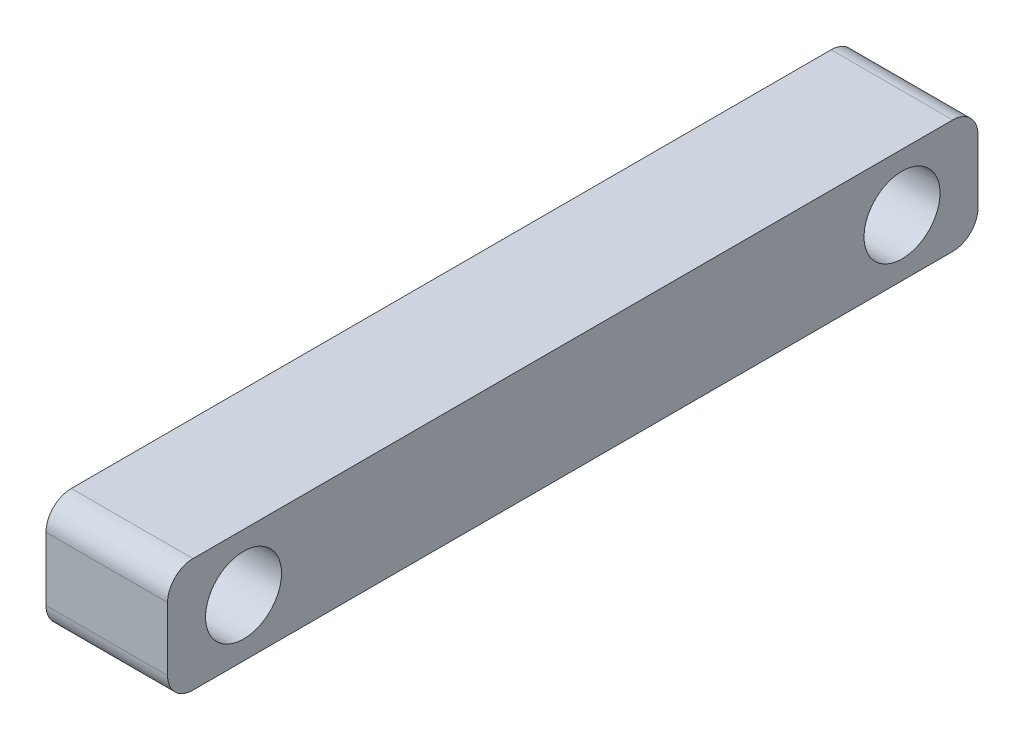
ISO-10303-21;
HEADER;
FILE_DESCRIPTION(('STEP AP214'),'2;1');
FILE_NAME('part.step','',(''),(''),'','','');
FILE_SCHEMA(('AUTOMOTIVE_DESIGN { 1 0 10303 214 1 1 1 1 }'));
ENDSEC;
DATA;
#1=APPLICATION_CONTEXT('core data for automotive mechanical design processes');
#2=APPLICATION_PROTOCOL_DEFINITION('international standard','automotive_design',2000,#1);
#3=PRODUCT_CONTEXT('',#1,'mechanical');
#4=PRODUCT('Part','Part','',(#3));
#5=PRODUCT_RELATED_PRODUCT_CATEGORY('part','',(#4));
#6=PRODUCT_DEFINITION_FORMATION('','',#4);
#7=PRODUCT_DEFINITION_CONTEXT('part definition',#1,'design');
#8=PRODUCT_DEFINITION('design','',#6,#7);
#9=PRODUCT_DEFINITION_SHAPE('','',#8);
#10=(LENGTH_UNIT() NAMED_UNIT(*) SI_UNIT(.MILLI.,.METRE.));
#11=(NAMED_UNIT(*) PLANE_ANGLE_UNIT() SI_UNIT($,.RADIAN.));
#12=(NAMED_UNIT(*) SI_UNIT($,.STERADIAN.) SOLID_ANGLE_UNIT());
#13=UNCERTAINTY_MEASURE_WITH_UNIT(LENGTH_MEASURE(1.E-05),#10,'distance_accuracy_value','');
#14=(GEOMETRIC_REPRESENTATION_CONTEXT(3) GLOBAL_UNCERTAINTY_ASSIGNED_CONTEXT((#13)) GLOBAL_UNIT_ASSIGNED_CONTEXT((#10,
#11,#12)) REPRESENTATION_CONTEXT('',''));
#15=CARTESIAN_POINT('',(0.,0.,0.));
#16=DIRECTION('',(0.,0.,1.));
#17=DIRECTION('',(1.,0.,0.));
#18=AXIS2_PLACEMENT_3D('',#15,#16,#17);
#19=CARTESIAN_POINT('',(2.4,-1.25,15.));
#20=DIRECTION('',(-1.,0.,0.));
#21=DIRECTION('',(0.,0.,1.));
#22=AXIS2_PLACEMENT_3D('',#19,#20,#21);
#23=CYLINDRICAL_SURFACE('',#22,1.);
#24=CARTESIAN_POINT('',(-2.4,-1.25,15.));
#25=DIRECTION('',(1.,0.,0.));
#26=DIRECTION('',(0.,0.,-1.));
#27=AXIS2_PLACEMENT_3D('',#24,#25,#26);
#28=CIRCLE('',#27,1.);
#29=CARTESIAN_POINT('',(-2.4,-1.25,16.));
#30=VERTEX_POINT('',#29);
#31=CARTESIAN_POINT('',(-2.4,-2.25,15.));
#32=VERTEX_POINT('',#31);
#33=EDGE_CURVE('E129',#30,#32,#28,.T.);
#34=ORIENTED_EDGE('',*,*,#33,.T.);
#35=DIRECTION('',(-1.,0.,0.));
#36=VECTOR('',#35,1.);
#37=CARTESIAN_POINT('',(2.4,-2.25,15.));
#38=LINE('',#37,#36);
#39=CARTESIAN_POINT('',(2.4,-2.25,15.));
#40=VERTEX_POINT('',#39);
#41=EDGE_CURVE('E11',#40,#32,#38,.T.);
#42=ORIENTED_EDGE('',*,*,#41,.F.);
#43=CARTESIAN_POINT('',(2.4,-1.25,15.));
#44=DIRECTION('',(1.,0.,0.));
#45=DIRECTION('',(0.,0.,-1.));
#46=AXIS2_PLACEMENT_3D('',#43,#44,#45);
#47=CIRCLE('',#46,1.);
#48=CARTESIAN_POINT('',(2.4,-1.25,16.));
#49=VERTEX_POINT('',#48);
#50=EDGE_CURVE('E144',#49,#40,#47,.T.);
#51=ORIENTED_EDGE('',*,*,#50,.F.);
#52=DIRECTION('',(-1.,0.,0.));
#53=VECTOR('',#52,1.);
#54=CARTESIAN_POINT('',(2.4,-1.25,16.));
#55=LINE('',#54,#53);
#56=EDGE_CURVE('E125',#49,#30,#55,.T.);
#57=ORIENTED_EDGE('',*,*,#56,.T.);
#58=EDGE_LOOP('',(#34,#42,#51,#57));
#59=FACE_BOUND('',#58,.T.);
#60=ADVANCED_FACE('F33',(#59),#23,.T.);
#61=CARTESIAN_POINT('',(2.4,-2.25,15.));
#62=DIRECTION('',(0.,1.,0.));
#63=DIRECTION('',(0.,0.,1.));
#64=AXIS2_PLACEMENT_3D('',#61,#62,#63);
#65=PLANE('',#64);
#66=DIRECTION('',(0.,0.,-1.));
#67=VECTOR('',#66,1.);
#68=CARTESIAN_POINT('',(-2.4,-2.25,15.));
#69=LINE('',#68,#67);
#70=CARTESIAN_POINT('',(-2.4,-2.25,-15.));
#71=VERTEX_POINT('',#70);
#72=EDGE_CURVE('E132',#32,#71,#69,.T.);
#73=ORIENTED_EDGE('',*,*,#72,.T.);
#74=DIRECTION('',(-1.,0.,0.));
#75=VECTOR('',#74,1.);
#76=CARTESIAN_POINT('',(2.4,-2.25,-15.));
#77=LINE('',#76,#75);
#78=CARTESIAN_POINT('',(2.4,-2.25,-15.));
#79=VERTEX_POINT('',#78);
#80=EDGE_CURVE('E41',#79,#71,#77,.T.);
#81=ORIENTED_EDGE('',*,*,#80,.F.);
#82=DIRECTION('',(0.,0.,-1.));
#83=VECTOR('',#82,1.);
#84=CARTESIAN_POINT('',(2.4,-2.25,15.));
#85=LINE('',#84,#83);
#86=EDGE_CURVE('E92',#40,#79,#85,.T.);
#87=ORIENTED_EDGE('',*,*,#86,.F.);
#88=ORIENTED_EDGE('',*,*,#41,.T.);
#89=EDGE_LOOP('',(#73,#81,#87,#88));
#90=FACE_BOUND('',#89,.T.);
#91=ADVANCED_FACE('F211',(#90),#65,.F.);
#92=CARTESIAN_POINT('',(2.4,-1.25,-15.));
#93=DIRECTION('',(-1.,0.,0.));
#94=DIRECTION('',(0.,0.,1.));
#95=AXIS2_PLACEMENT_3D('',#92,#93,#94);
#96=CYLINDRICAL_SURFACE('',#95,0.999999999999999);
#97=CARTESIAN_POINT('',(-2.4,-1.25,-15.));
#98=DIRECTION('',(1.,0.,0.));
#99=DIRECTION('',(0.,0.,-1.));
#100=AXIS2_PLACEMENT_3D('',#97,#98,#99);
#101=CIRCLE('',#100,0.999999999999999);
#102=CARTESIAN_POINT('',(-2.4,-1.25,-16.));
#103=VERTEX_POINT('',#102);
#104=EDGE_CURVE('E135',#71,#103,#101,.T.);
#105=ORIENTED_EDGE('',*,*,#104,.T.);
#106=DIRECTION('',(-1.,0.,0.));
#107=VECTOR('',#106,1.);
#108=CARTESIAN_POINT('',(2.4,-1.25,-16.));
#109=LINE('',#108,#107);
#110=CARTESIAN_POINT('',(2.4,-1.25,-16.));
#111=VERTEX_POINT('',#110);
#112=EDGE_CURVE('E151',#111,#103,#109,.T.);
#113=ORIENTED_EDGE('',*,*,#112,.F.);
#114=CARTESIAN_POINT('',(2.4,-1.25,-15.));
#115=DIRECTION('',(1.,0.,0.));
#116=DIRECTION('',(0.,0.,-1.));
#117=AXIS2_PLACEMENT_3D('',#114,#115,#116);
#118=CIRCLE('',#117,0.999999999999999);
#119=EDGE_CURVE('E159',#79,#111,#118,.T.);
#120=ORIENTED_EDGE('',*,*,#119,.F.);
#121=ORIENTED_EDGE('',*,*,#80,.T.);
#122=EDGE_LOOP('',(#105,#113,#120,#121));
#123=FACE_BOUND('',#122,.T.);
#124=ADVANCED_FACE('F157',(#123),#96,.T.);
#125=CARTESIAN_POINT('',(2.4,1.25,-16.));
#126=DIRECTION('',(0.,0.,1.));
#127=DIRECTION('',(1.,0.,0.));
#128=AXIS2_PLACEMENT_3D('',#125,#126,#127);
#129=PLANE('',#128);
#130=DIRECTION('',(0.,1.,0.));
#131=VECTOR('',#130,1.);
#132=CARTESIAN_POINT('',(-2.4,1.25,-16.));
#133=LINE('',#132,#131);
#134=CARTESIAN_POINT('',(-2.4,1.25,-16.));
#135=VERTEX_POINT('',#134);
#136=EDGE_CURVE('E137',#103,#135,#133,.T.);
#137=ORIENTED_EDGE('',*,*,#136,.T.);
#138=DIRECTION('',(-1.,0.,0.));
#139=VECTOR('',#138,1.);
#140=CARTESIAN_POINT('',(2.4,1.25,-16.));
#141=LINE('',#140,#139);
#142=CARTESIAN_POINT('',(2.4,1.25,-16.));
#143=VERTEX_POINT('',#142);
#144=EDGE_CURVE('E148',#143,#135,#141,.T.);
#145=ORIENTED_EDGE('',*,*,#144,.F.);
#146=DIRECTION('',(0.,1.,0.));
#147=VECTOR('',#146,1.);
#148=CARTESIAN_POINT('',(2.4,1.25,-16.));
#149=LINE('',#148,#147);
#150=EDGE_CURVE('E171',#111,#143,#149,.T.);
#151=ORIENTED_EDGE('',*,*,#150,.F.);
#152=ORIENTED_EDGE('',*,*,#112,.T.);
#153=EDGE_LOOP('',(#137,#145,#151,#152));
#154=FACE_BOUND('',#153,.T.);
#155=ADVANCED_FACE('F167',(#154),#129,.F.);
#156=CARTESIAN_POINT('',(2.4,1.25,-15.));
#157=DIRECTION('',(-1.,0.,0.));
#158=DIRECTION('',(0.,0.,1.));
#159=AXIS2_PLACEMENT_3D('',#156,#157,#158);
#160=CYLINDRICAL_SURFACE('',#159,0.999999999999999);
#161=CARTESIAN_POINT('',(-2.4,1.25,-15.));
#162=DIRECTION('',(1.,0.,0.));
#163=DIRECTION('',(0.,0.,1.));
#164=AXIS2_PLACEMENT_3D('',#161,#162,#163);
#165=CIRCLE('',#164,0.999999999999999);
#166=CARTESIAN_POINT('',(-2.4,2.25,-15.));
#167=VERTEX_POINT('',#166);
#168=EDGE_CURVE('E139',#135,#167,#165,.T.);
#169=ORIENTED_EDGE('',*,*,#168,.T.);
#170=DIRECTION('',(-1.,0.,0.));
#171=VECTOR('',#170,1.);
#172=CARTESIAN_POINT('',(2.4,2.25,-15.));
#173=LINE('',#172,#171);
#174=CARTESIAN_POINT('',(2.4,2.25,-15.));
#175=VERTEX_POINT('',#174);
#176=EDGE_CURVE('E120',#175,#167,#173,.T.);
#177=ORIENTED_EDGE('',*,*,#176,.F.);
#178=CARTESIAN_POINT('',(2.4,1.25,-15.));
#179=DIRECTION('',(1.,0.,0.));
#180=DIRECTION('',(0.,0.,1.));
#181=AXIS2_PLACEMENT_3D('',#178,#179,#180);
#182=CIRCLE('',#181,0.999999999999999);
#183=EDGE_CURVE('E111',#143,#175,#182,.T.);
#184=ORIENTED_EDGE('',*,*,#183,.F.);
#185=ORIENTED_EDGE('',*,*,#144,.T.);
#186=EDGE_LOOP('',(#169,#177,#184,#185));
#187=FACE_BOUND('',#186,.T.);
#188=ADVANCED_FACE('F170',(#187),#160,.T.);
#189=CARTESIAN_POINT('',(2.4,2.25,15.));
#190=DIRECTION('',(0.,-1.,0.));
#191=DIRECTION('',(0.,0.,-1.));
#192=AXIS2_PLACEMENT_3D('',#189,#190,#191);
#193=PLANE('',#192);
#194=DIRECTION('',(0.,0.,1.));
#195=VECTOR('',#194,1.);
#196=CARTESIAN_POINT('',(-2.4,2.25,15.));
#197=LINE('',#196,#195);
#198=CARTESIAN_POINT('',(-2.4,2.25,15.));
#199=VERTEX_POINT('',#198);
#200=EDGE_CURVE('E119',#167,#199,#197,.T.);
#201=ORIENTED_EDGE('',*,*,#200,.T.);
#202=DIRECTION('',(-1.,0.,0.));
#203=VECTOR('',#202,1.);
#204=CARTESIAN_POINT('',(2.4,2.25,15.));
#205=LINE('',#204,#203);
#206=CARTESIAN_POINT('',(2.4,2.25,15.));
#207=VERTEX_POINT('',#206);
#208=EDGE_CURVE('E116',#207,#199,#205,.T.);
#209=ORIENTED_EDGE('',*,*,#208,.F.);
#210=DIRECTION('',(0.,0.,1.));
#211=VECTOR('',#210,1.);
#212=CARTESIAN_POINT('',(2.4,2.25,15.));
#213=LINE('',#212,#211);
#214=EDGE_CURVE('E105',#175,#207,#213,.T.);
#215=ORIENTED_EDGE('',*,*,#214,.F.);
#216=ORIENTED_EDGE('',*,*,#176,.T.);
#217=EDGE_LOOP('',(#201,#209,#215,#216));
#218=FACE_BOUND('',#217,.T.);
#219=ADVANCED_FACE('F117',(#218),#193,.F.);
#220=CARTESIAN_POINT('',(2.4,1.25,15.));
#221=DIRECTION('',(-1.,0.,0.));
#222=DIRECTION('',(0.,0.,1.));
#223=AXIS2_PLACEMENT_3D('',#220,#221,#222);
#224=CYLINDRICAL_SURFACE('',#223,1.);
#225=CARTESIAN_POINT('',(-2.4,1.25,15.));
#226=DIRECTION('',(1.,0.,0.));
#227=DIRECTION('',(0.,0.,1.));
#228=AXIS2_PLACEMENT_3D('',#225,#226,#227);
#229=CIRCLE('',#228,1.);
#230=CARTESIAN_POINT('',(-2.4,1.25,16.));
#231=VERTEX_POINT('',#230);
#232=EDGE_CURVE('E78',#199,#231,#229,.T.);
#233=ORIENTED_EDGE('',*,*,#232,.T.);
#234=DIRECTION('',(-1.,0.,0.));
#235=VECTOR('',#234,1.);
#236=CARTESIAN_POINT('',(2.4,1.25,16.));
#237=LINE('',#236,#235);
#238=CARTESIAN_POINT('',(2.4,1.25,16.));
#239=VERTEX_POINT('',#238);
#240=EDGE_CURVE('E121',#239,#231,#237,.T.);
#241=ORIENTED_EDGE('',*,*,#240,.F.);
#242=CARTESIAN_POINT('',(2.4,1.25,15.));
#243=DIRECTION('',(1.,0.,0.));
#244=DIRECTION('',(0.,0.,1.));
#245=AXIS2_PLACEMENT_3D('',#242,#243,#244);
#246=CIRCLE('',#245,1.);
#247=EDGE_CURVE('E109',#207,#239,#246,.T.);
#248=ORIENTED_EDGE('',*,*,#247,.F.);
#249=ORIENTED_EDGE('',*,*,#208,.T.);
#250=EDGE_LOOP('',(#233,#241,#248,#249));
#251=FACE_BOUND('',#250,.T.);
#252=ADVANCED_FACE('F123',(#251),#224,.T.);
#253=CARTESIAN_POINT('',(2.4,1.25,16.));
#254=DIRECTION('',(0.,0.,-1.));
#255=DIRECTION('',(-1.,0.,0.));
#256=AXIS2_PLACEMENT_3D('',#253,#254,#255);
#257=PLANE('',#256);
#258=DIRECTION('',(0.,-1.,0.));
#259=VECTOR('',#258,1.);
#260=CARTESIAN_POINT('',(-2.4,1.25,16.));
#261=LINE('',#260,#259);
#262=EDGE_CURVE('E84',#231,#30,#261,.T.);
#263=ORIENTED_EDGE('',*,*,#262,.T.);
#264=ORIENTED_EDGE('',*,*,#56,.F.);
#265=DIRECTION('',(0.,-1.,0.));
#266=VECTOR('',#265,1.);
#267=CARTESIAN_POINT('',(2.4,1.25,16.));
#268=LINE('',#267,#266);
#269=EDGE_CURVE('E49',#239,#49,#268,.T.);
#270=ORIENTED_EDGE('',*,*,#269,.F.);
#271=ORIENTED_EDGE('',*,*,#240,.T.);
#272=EDGE_LOOP('',(#263,#264,#270,#271));
#273=FACE_BOUND('',#272,.T.);
#274=ADVANCED_FACE('F193',(#273),#257,.F.);
#275=CARTESIAN_POINT('',(2.4,-1.25,15.));
#276=DIRECTION('',(1.,0.,0.));
#277=DIRECTION('',(0.,0.,-1.));
#278=AXIS2_PLACEMENT_3D('',#275,#276,#277);
#279=PLANE('',#278);
#280=CARTESIAN_POINT('',(2.4,0.,13.));
#281=DIRECTION('',(1.,0.,0.));
#282=DIRECTION('',(0.,0.,-1.));
#283=AXIS2_PLACEMENT_3D('',#280,#281,#282);
#284=CIRCLE('',#283,1.5);
#285=CARTESIAN_POINT('',(2.4,0.,11.5));
#286=VERTEX_POINT('',#285);
#287=EDGE_CURVE('E180',#286,#286,#284,.T.);
#288=ORIENTED_EDGE('',*,*,#287,.F.);
#289=EDGE_LOOP('',(#288));
#290=FACE_BOUND('',#289,.T.);
#291=CARTESIAN_POINT('',(2.4,0.,-13.));
#292=DIRECTION('',(1.,0.,0.));
#293=DIRECTION('',(0.,0.,-1.));
#294=AXIS2_PLACEMENT_3D('',#291,#292,#293);
#295=CIRCLE('',#294,1.5);
#296=CARTESIAN_POINT('',(2.4,0.,-14.5));
#297=VERTEX_POINT('',#296);
#298=EDGE_CURVE('E181',#297,#297,#295,.T.);
#299=ORIENTED_EDGE('',*,*,#298,.F.);
#300=EDGE_LOOP('',(#299));
#301=FACE_BOUND('',#300,.T.);
#302=ORIENTED_EDGE('',*,*,#50,.T.);
#303=ORIENTED_EDGE('',*,*,#86,.T.);
#304=ORIENTED_EDGE('',*,*,#119,.T.);
#305=ORIENTED_EDGE('',*,*,#150,.T.);
#306=ORIENTED_EDGE('',*,*,#183,.T.);
#307=ORIENTED_EDGE('',*,*,#214,.T.);
#308=ORIENTED_EDGE('',*,*,#247,.T.);
#309=ORIENTED_EDGE('',*,*,#269,.T.);
#310=EDGE_LOOP('',(#302,#303,#304,#305,#306,#307,#308,#309));
#311=FACE_BOUND('',#310,.T.);
#312=ADVANCED_FACE('F107',(#290,#301,#311),#279,.T.);
#313=CARTESIAN_POINT('',(-2.4,-1.25,15.));
#314=DIRECTION('',(1.,0.,0.));
#315=DIRECTION('',(0.,0.,-1.));
#316=AXIS2_PLACEMENT_3D('',#313,#314,#315);
#317=PLANE('',#316);
#318=CARTESIAN_POINT('',(-2.4,0.,13.));
#319=DIRECTION('',(1.,0.,0.));
#320=DIRECTION('',(0.,0.,-1.));
#321=AXIS2_PLACEMENT_3D('',#318,#319,#320);
#322=CIRCLE('',#321,1.5);
#323=CARTESIAN_POINT('',(-2.4,0.,11.5));
#324=VERTEX_POINT('',#323);
#325=EDGE_CURVE('E133',#324,#324,#322,.T.);
#326=ORIENTED_EDGE('',*,*,#325,.T.);
#327=EDGE_LOOP('',(#326));
#328=FACE_BOUND('',#327,.T.);
#329=CARTESIAN_POINT('',(-2.4,0.,-13.));
#330=DIRECTION('',(1.,0.,0.));
#331=DIRECTION('',(0.,0.,-1.));
#332=AXIS2_PLACEMENT_3D('',#329,#330,#331);
#333=CIRCLE('',#332,1.5);
#334=CARTESIAN_POINT('',(-2.4,0.,-14.5));
#335=VERTEX_POINT('',#334);
#336=EDGE_CURVE('E177',#335,#335,#333,.T.);
#337=ORIENTED_EDGE('',*,*,#336,.T.);
#338=EDGE_LOOP('',(#337));
#339=FACE_BOUND('',#338,.T.);
#340=ORIENTED_EDGE('',*,*,#33,.F.);
#341=ORIENTED_EDGE('',*,*,#262,.F.);
#342=ORIENTED_EDGE('',*,*,#232,.F.);
#343=ORIENTED_EDGE('',*,*,#200,.F.);
#344=ORIENTED_EDGE('',*,*,#168,.F.);
#345=ORIENTED_EDGE('',*,*,#136,.F.);
#346=ORIENTED_EDGE('',*,*,#104,.F.);
#347=ORIENTED_EDGE('',*,*,#72,.F.);
#348=EDGE_LOOP('',(#340,#341,#342,#343,#344,#345,#346,#347));
#349=FACE_BOUND('',#348,.T.);
#350=ADVANCED_FACE('F163',(#328,#339,#349),#317,.F.);
#351=CARTESIAN_POINT('',(-2.4,0.,-13.));
#352=DIRECTION('',(1.,0.,0.));
#353=DIRECTION('',(0.,0.,-1.));
#354=AXIS2_PLACEMENT_3D('',#351,#352,#353);
#355=CYLINDRICAL_SURFACE('',#354,1.5);
#356=ORIENTED_EDGE('',*,*,#336,.F.);
#357=EDGE_LOOP('',(#356));
#358=FACE_BOUND('',#357,.T.);
#359=ORIENTED_EDGE('',*,*,#298,.T.);
#360=EDGE_LOOP('',(#359));
#361=FACE_BOUND('',#360,.T.);
#362=ADVANCED_FACE('F197',(#358,#361),#355,.F.);
#363=CARTESIAN_POINT('',(-2.4,0.,13.));
#364=DIRECTION('',(1.,0.,0.));
#365=DIRECTION('',(0.,0.,-1.));
#366=AXIS2_PLACEMENT_3D('',#363,#364,#365);
#367=CYLINDRICAL_SURFACE('',#366,1.5);
#368=ORIENTED_EDGE('',*,*,#325,.F.);
#369=EDGE_LOOP('',(#368));
#370=FACE_BOUND('',#369,.T.);
#371=ORIENTED_EDGE('',*,*,#287,.T.);
#372=EDGE_LOOP('',(#371));
#373=FACE_BOUND('',#372,.T.);
#374=ADVANCED_FACE('F189',(#370,#373),#367,.F.);
#375=CLOSED_SHELL('',(#60,#91,#124,#155,#188,#219,#252,#274,#312,#350,#362,#374));
#376=MANIFOLD_SOLID_BREP('B2',#375);
#377=ADVANCED_BREP_SHAPE_REPRESENTATION('',(#18,#376),#14);
#378=SHAPE_DEFINITION_REPRESENTATION(#9,#377);
ENDSEC;
END-ISO-10303-21;
